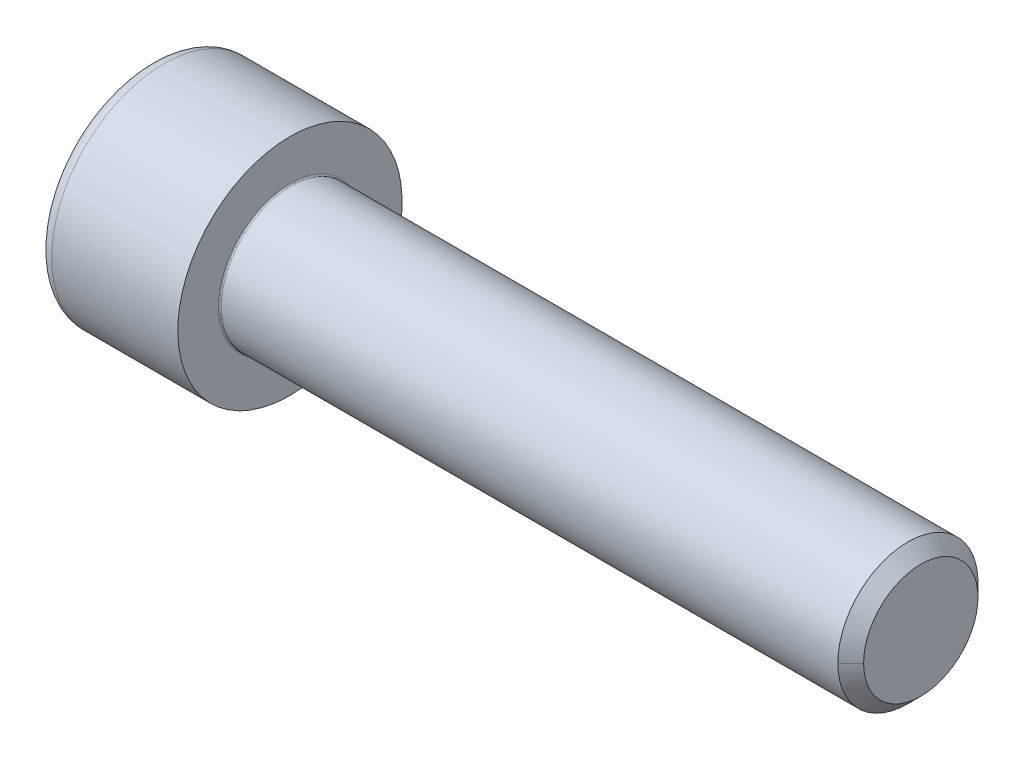
ISO-10303-21;
HEADER;
FILE_DESCRIPTION(('STEP AP214'),'2;1');
FILE_NAME('part.step','',(''),(''),'','','');
FILE_SCHEMA(('AUTOMOTIVE_DESIGN { 1 0 10303 214 1 1 1 1 }'));
ENDSEC;
DATA;
#1=APPLICATION_CONTEXT('core data for automotive mechanical design processes');
#2=APPLICATION_PROTOCOL_DEFINITION('international standard','automotive_design',2000,#1);
#3=PRODUCT_CONTEXT('',#1,'mechanical');
#4=PRODUCT('Part','Part','',(#3));
#5=PRODUCT_RELATED_PRODUCT_CATEGORY('part','',(#4));
#6=PRODUCT_DEFINITION_FORMATION('','',#4);
#7=PRODUCT_DEFINITION_CONTEXT('part definition',#1,'design');
#8=PRODUCT_DEFINITION('design','',#6,#7);
#9=PRODUCT_DEFINITION_SHAPE('','',#8);
#10=(LENGTH_UNIT() NAMED_UNIT(*) SI_UNIT(.MILLI.,.METRE.));
#11=(NAMED_UNIT(*) PLANE_ANGLE_UNIT() SI_UNIT($,.RADIAN.));
#12=(NAMED_UNIT(*) SI_UNIT($,.STERADIAN.) SOLID_ANGLE_UNIT());
#13=UNCERTAINTY_MEASURE_WITH_UNIT(LENGTH_MEASURE(1.E-05),#10,'distance_accuracy_value','');
#14=(GEOMETRIC_REPRESENTATION_CONTEXT(3) GLOBAL_UNCERTAINTY_ASSIGNED_CONTEXT((#13)) GLOBAL_UNIT_ASSIGNED_CONTEXT((#10,
#11,#12)) REPRESENTATION_CONTEXT('',''));
#15=CARTESIAN_POINT('',(0.,0.,0.));
#16=DIRECTION('',(0.,0.,1.));
#17=DIRECTION('',(1.,0.,0.));
#18=AXIS2_PLACEMENT_3D('',#15,#16,#17);
#19=CARTESIAN_POINT('',(-2.333333333,0.,0.));
#20=CARTESIAN_POINT('',(-5.016,0.,4.646514966));
#21=(BOUNDED_CURVE() B_SPLINE_CURVE(1,(#19,#20),.UNSPECIFIED.,.F.,
.F.) B_SPLINE_CURVE_WITH_KNOTS((2,2),(0.,1.),
.UNSPECIFIED.) CURVE() GEOMETRIC_REPRESENTATION_ITEM() RATIONAL_B_SPLINE_CURVE((1.,1.)) REPRESENTATION_ITEM(''));
#22=CARTESIAN_POINT('',(994.984,0.,0.));
#23=DIRECTION('',(-1.,0.,0.));
#24=AXIS1_PLACEMENT('',#22,#23);
#25=SURFACE_OF_REVOLUTION('',#21,#24);
#26=CARTESIAN_POINT('',(-2.333333333,0.,0.));
#27=VERTEX_POINT('',#26);
#28=VERTEX_LOOP('',#27);
#29=FACE_BOUND('',#28,.T.);
#30=CARTESIAN_POINT('',(-5.00000000006482,-4.,-2.30940107611895));
#31=CARTESIAN_POINT('',(-4.97135318953182,-4.,-2.21015744036067));
#32=CARTESIAN_POINT('',(-4.94397746479668,-4.,-2.1105358752082));
#33=CARTESIAN_POINT('',(-4.89209376988705,-4.,-1.91043798441548));
#34=CARTESIAN_POINT('',(-4.86758886314897,-4.,-1.80996086623569));
#35=CARTESIAN_POINT('',(-4.82182768901577,-4.,-1.60823298767985));
#36=CARTESIAN_POINT('',(-4.80057238759109,-4.,-1.50698200662196));
#37=CARTESIAN_POINT('',(-4.76171749202954,-4.,-1.30395732887976));
#38=CARTESIAN_POINT('',(-4.74411169613708,-4.,-1.20218482517622));
#39=CARTESIAN_POINT('',(-4.71285993171777,-4.,-0.998057174168331));
#40=CARTESIAN_POINT('',(-4.6992128868808,-4.,-0.895702192959739));
#41=CARTESIAN_POINT('',(-4.67617244381568,-4.,-0.690517955862912));
#42=CARTESIAN_POINT('',(-4.66677887535889,-4.,-0.5876887191213));
#43=CARTESIAN_POINT('',(-4.65011682591935,-4.,-0.347733375104196));
#44=CARTESIAN_POINT('',(-4.64457143875763,-4.,-0.2104827897911));
#45=CARTESIAN_POINT('',(-4.64166994989457,-4.,0.0641549625196647));
#46=CARTESIAN_POINT('',(-4.64431698574091,-4.,0.20154216169588));
#47=CARTESIAN_POINT('',(-4.65768334718873,-4.,0.475919706875249));
#48=CARTESIAN_POINT('',(-4.66840273377248,-4.,0.612910049872519));
#49=CARTESIAN_POINT('',(-4.69743964515601,-4.,0.886008596477056));
#50=CARTESIAN_POINT('',(-4.71575366740527,-4.,1.02211717739193));
#51=CARTESIAN_POINT('',(-4.75926532590689,-4.,1.29321352913059));
#52=CARTESIAN_POINT('',(-4.7844628536655,-4.,1.42820131758511));
#53=CARTESIAN_POINT('',(-4.84089995195073,-4.,1.69685903051749));
#54=CARTESIAN_POINT('',(-4.87213779969015,-4.,1.83052931936778));
#55=CARTESIAN_POINT('',(-4.92071313950291,-4.,2.02146177333866));
#56=CARTESIAN_POINT('',(-4.93594565661347,-4.,2.07926975435966));
#57=CARTESIAN_POINT('',(-4.96731071446001,-4.,2.19455934731437));
#58=CARTESIAN_POINT('',(-4.9834420419316,-4.,2.25204128908881));
#59=CARTESIAN_POINT('',(-5.00000000014676,-4.,2.30940107640279));
#60=B_SPLINE_CURVE_WITH_KNOTS('',3,(#30,#31,#32,#33,#34,#35,#36,#37,#38,#39,#40,#41,#42,#43,#44,
#45,#46,#47,#48,#49,#50,#51,#52,#53,#54,#55,#56,#57,#58,#59),.UNSPECIFIED.,.F.,.F.,(4,2,2,2,2,2,
2,2,2,2,2,2,2,2,4),(0.,0.309893484433195,0.620114699394315,0.93042795147056,1.24020947239432,
1.54990669042629,1.85959151295208,2.27142973921779,2.68342571148235,3.09542479618574,
3.50723408303071,3.91903687955532,4.33072239670914,4.51006028318604,4.68916169313103),.UNSPECIFIED.);
#61=CARTESIAN_POINT('',(-5.0000000001568,-3.99999999989444,-2.30940107662042));
#62=VERTEX_POINT('',#61);
#63=CARTESIAN_POINT('',(-4.99999999975451,-3.99999999977153,2.30940107713191));
#64=VERTEX_POINT('',#63);
#65=EDGE_CURVE('E113',#62,#64,#60,.T.);
#66=ORIENTED_EDGE('',*,*,#65,.T.);
#67=CARTESIAN_POINT('',(-5.00000000016685,-3.99999999954306,2.30940107726382));
#68=CARTESIAN_POINT('',(-4.97135318963593,-3.91405248981054,2.35902289514925));
#69=CARTESIAN_POINT('',(-4.94397746490307,-3.82777768362181,2.40883367773181));
#70=CARTESIAN_POINT('',(-4.8920937699984,-3.65448782694781,2.50888262314083));
#71=CARTESIAN_POINT('',(-4.86758886326301,-3.56747209010316,2.55912118223708));
#72=CARTESIAN_POINT('',(-4.82182768913561,-3.39277062261852,2.65998512152771));
#73=CARTESIAN_POINT('',(-4.80057238771403,-3.30508470086244,2.71061061206301));
#74=CARTESIAN_POINT('',(-4.76171749215909,-3.12926017233892,2.81212295094683));
#75=CARTESIAN_POINT('',(-4.74411169627012,-3.04112259872311,2.86300920280495));
#76=CARTESIAN_POINT('',(-4.71285993185824,-2.86434286733196,2.96507302832157));
#77=CARTESIAN_POINT('',(-4.6992128870252,-2.77570085339976,3.01625051893219));
#78=CARTESIAN_POINT('',(-4.67617244396809,-2.59800609161458,3.11884263749318));
#79=CARTESIAN_POINT('',(-4.6667788755154,-2.50895336034306,3.17025725587024));
#80=CARTESIAN_POINT('',(-4.65011682608512,-2.3011459366396,3.29023492789758));
#81=CARTESIAN_POINT('',(-4.64457143892918,-2.18228344306491,3.35886022056665));
#82=CARTESIAN_POINT('',(-4.64166995007861,-1.94444017270732,3.49617909674691));
#83=CARTESIAN_POINT('',(-4.64431698593167,-1.82545936805698,3.56487269634737));
#84=CARTESIAN_POINT('',(-4.65768334739383,-1.58784144368608,3.70206146896153));
#85=CARTESIAN_POINT('',(-4.66840273398519,-1.46920432656869,3.7705566404723));
#86=CARTESIAN_POINT('',(-4.69743964538433,-1.23269404745584,3.9071059137985));
#87=CARTESIAN_POINT('',(-4.71575366764156,-1.11482055870239,3.97516020426774));
#88=CARTESIAN_POINT('',(-4.75926532615933,-0.880044231207485,4.11070838016045));
#89=CARTESIAN_POINT('',(-4.78446285392611,-0.763141377197368,4.17820227439928));
#90=CARTESIAN_POINT('',(-4.84089995222764,-0.530476972859852,4.31253113088844));
#91=CARTESIAN_POINT('',(-4.8721377999752,-0.414715106976668,4.37936627532498));
#92=CARTESIAN_POINT('',(-4.92071313976593,-0.249362751534562,4.4748325022606));
#93=CARTESIAN_POINT('',(-4.93594565684413,-0.199299571539531,4.50373649271024));
#94=CARTESIAN_POINT('',(-4.96731071462198,-0.0994558554688469,4.56138128906657));
#95=CARTESIAN_POINT('',(-4.98344204205724,-0.0496750337427324,4.59012225989363));
#96=CARTESIAN_POINT('',(-5.00000000023427,-8.82094370132308E-10,4.61880215349072));
#97=B_SPLINE_CURVE_WITH_KNOTS('',3,(#67,#68,#69,#70,#71,#72,#73,#74,#75,#76,#77,#78,#79,#80,#81,
#82,#83,#84,#85,#86,#87,#88,#89,#90,#91,#92,#93,#94,#95,#96),.UNSPECIFIED.,.F.,.F.,(4,2,2,2,2,2,
2,2,2,2,2,2,2,2,4),(0.,0.309893484445331,0.62011469941857,0.930427951506925,1.24020947244285,
1.54990669048699,1.85959151302494,2.27142973933271,2.68342571163939,3.09542479638498,
3.50723408327159,3.91903687983777,4.33072239703306,4.51006028311902,4.68916169267404),.UNSPECIFIED.);
#98=CARTESIAN_POINT('',(-5.0000000002909,-1.17252272700096E-10,4.6188021535888));
#99=VERTEX_POINT('',#98);
#100=EDGE_CURVE('E109',#64,#99,#97,.T.);
#101=ORIENTED_EDGE('',*,*,#100,.T.);
#102=CARTESIAN_POINT('',(-5.00000000032998,5.94972159506391E-10,4.6188021536565));
#103=CARTESIAN_POINT('',(-4.97135318979258,0.0859475103312058,4.56918033576891));
#104=CARTESIAN_POINT('',(-4.94397746505306,0.172222316523666,4.5193695531842));
#105=CARTESIAN_POINT('',(-4.89209377013475,0.34551217320521,4.41932060777082));
#106=CARTESIAN_POINT('',(-4.86758886339237,0.432527910053683,4.36908204867237));
#107=CARTESIAN_POINT('',(-4.82182768925074,0.607229377546093,4.26821810937725));
#108=CARTESIAN_POINT('',(-4.80057238782191,0.694915299306115,4.21759261883967));
#109=CARTESIAN_POINT('',(-4.76171749225217,0.870739827838095,4.11608027995098));
#110=CARTESIAN_POINT('',(-4.74411169635568,0.958877401458407,4.06519402809025));
#111=CARTESIAN_POINT('',(-4.7128599319287,1.13565713285879,3.9631302025683));
#112=CARTESIAN_POINT('',(-4.69921288708808,1.22429914679571,3.91195271195495));
#113=CARTESIAN_POINT('',(-4.67617244401594,1.40199390859061,3.80936059338835));
#114=CARTESIAN_POINT('',(-4.66677887555579,1.49104663986712,3.75794597500841));
#115=CARTESIAN_POINT('',(-4.65011682610934,1.69885406357111,3.63796830298076));
#116=CARTESIAN_POINT('',(-4.64457143894404,1.8177165571414,3.56934301031423));
#117=CARTESIAN_POINT('',(-4.6416699500741,2.05555982749067,3.43202413413878));
#118=CARTESIAN_POINT('',(-4.64431698591716,2.1745406321371,3.36333053454058));
#119=CARTESIAN_POINT('',(-4.65768334735915,2.41215855650067,3.22614176193065));
#120=CARTESIAN_POINT('',(-4.66840273394034,2.53079567361464,3.15764659042185));
#121=CARTESIAN_POINT('',(-4.69743964531933,2.76730595272089,3.02109731709947));
#122=CARTESIAN_POINT('',(-4.71575366756658,2.88517944147114,2.95304302663207));
#123=CARTESIAN_POINT('',(-4.75926532606492,3.11995576896001,2.81749485074285));
#124=CARTESIAN_POINT('',(-4.78446285382227,3.23685862296728,2.75000095650566));
#125=CARTESIAN_POINT('',(-4.84089995210564,3.4695230272993,2.61567210001968));
#126=CARTESIAN_POINT('',(-4.87213779984446,3.58528489317983,2.54883695558467));
#127=CARTESIAN_POINT('',(-4.92071313962745,3.75063724863275,2.4533707286428));
#128=CARTESIAN_POINT('',(-4.93594565670664,3.80070042864115,2.42446673818544));
#129=CARTESIAN_POINT('',(-4.96731071448712,3.90054414473846,2.36682194181374));
#130=CARTESIAN_POINT('',(-4.98344204192404,3.95032496647782,2.33808097097903));
#131=CARTESIAN_POINT('',(-5.00000000010304,3.99999999935165,2.30940107737433));
#132=B_SPLINE_CURVE_WITH_KNOTS('',3,(#102,#103,#104,#105,#106,#107,#108,#109,#110,#111,#112,
#113,#114,#115,#116,#117,#118,#119,#120,#121,#122,#123,#124,#125,#126,#127,#128,#129,#130,#131),
.UNSPECIFIED.,.F.,.F.,(4,2,2,2,2,2,2,2,2,2,2,2,2,2,4),(0.,0.30989348446309,0.620114699454161,
0.930427951560375,1.24020947251555,1.54990669057891,1.8595915131361,2.27142973942983,
2.68342571172239,3.0954247964538,3.50723408332542,3.91903687987668,4.33072239705703,
4.51006028318852,4.68916169278907),.UNSPECIFIED.);
#133=CARTESIAN_POINT('',(-4.99999999977637,4.,2.30940107681191));
#134=VERTEX_POINT('',#133);
#135=EDGE_CURVE('E92',#99,#134,#132,.T.);
#136=ORIENTED_EDGE('',*,*,#135,.T.);
#137=CARTESIAN_POINT('',(-5.00000000021056,4.,2.30940107662382));
#138=CARTESIAN_POINT('',(-4.97135318967179,4.,2.21015744086173));
#139=CARTESIAN_POINT('',(-4.94397746493073,4.,2.11053587570543));
#140=CARTESIAN_POINT('',(-4.89209377000895,4.,1.91043798490497));
#141=CARTESIAN_POINT('',(-4.86758886326464,4.,1.80996086672125));
#142=CARTESIAN_POINT('',(-4.8218276891187,4.,1.60823298815746));
#143=CARTESIAN_POINT('',(-4.8005723876875,4.,1.50698200709554));
#144=CARTESIAN_POINT('',(-4.76171749211271,4.,1.30395732934463));
#145=CARTESIAN_POINT('',(-4.74411169621354,4.,1.20218482563642));
#146=CARTESIAN_POINT('',(-4.71285993178078,4.,0.998057174618954));
#147=CARTESIAN_POINT('',(-4.69921288693708,4.,0.895702193405464));
#148=CARTESIAN_POINT('',(-4.6761724438585,4.,0.690517956298578));
#149=CARTESIAN_POINT('',(-4.66677887539499,4.,0.587688719551803));
#150=CARTESIAN_POINT('',(-4.65011682594096,4.,0.347733375534113));
#151=CARTESIAN_POINT('',(-4.64457143877092,4.,0.21048279022553));
#152=CARTESIAN_POINT('',(-4.64166994989055,4.,-0.0641549620767052));
#153=CARTESIAN_POINT('',(-4.64431698572791,4.,-0.201542161248905));
#154=CARTESIAN_POINT('',(-4.65768334715775,4.,-0.475919706420755));
#155=CARTESIAN_POINT('',(-4.66840273373249,4.,-0.612910049414522));
#156=CARTESIAN_POINT('',(-4.69743964509803,4.,-0.886008596012247));
#157=CARTESIAN_POINT('',(-4.71575366733828,4.,-1.02211717692381));
#158=CARTESIAN_POINT('',(-4.75926532582251,4.,-1.2932135286562));
#159=CARTESIAN_POINT('',(-4.78446285357274,4.,-1.42820131710774));
#160=CARTESIAN_POINT('',(-4.84089995184177,4.,-1.69685903003438));
#161=CARTESIAN_POINT('',(-4.87213779957337,4.,-1.83052931888192));
#162=CARTESIAN_POINT('',(-4.92071313937493,4.,-2.02146177284733));
#163=CARTESIAN_POINT('',(-4.93594565648185,4.,-2.07926975386559));
#164=CARTESIAN_POINT('',(-4.96731071432123,4.,-2.19455934681486));
#165=CARTESIAN_POINT('',(-4.9834420417893,4.,-2.25204128858662));
#166=CARTESIAN_POINT('',(-5.00000000000102,4.,-2.30940107589792));
#167=B_SPLINE_CURVE_WITH_KNOTS('',3,(#137,#138,#139,#140,#141,#142,#143,#144,#145,#146,#147,
#148,#149,#150,#151,#152,#153,#154,#155,#156,#157,#158,#159,#160,#161,#162,#163,#164,#165,#166),
.UNSPECIFIED.,.F.,.F.,(4,2,2,2,2,2,2,2,2,2,2,2,2,2,4),(0.,0.309893484448983,0.620114699425957,
0.930427951518078,1.24020947245909,1.5499066905083,1.85959151305134,2.27142973930458,
2.68342571155658,3.09542479624739,3.5072340830789,3.91903687959009,4.33072239673047,
4.51006028319663,4.68916169313102),.UNSPECIFIED.);
#168=CARTESIAN_POINT('',(-4.99999999982738,3.99999999999015,-2.30940107700569));
#169=VERTEX_POINT('',#168);
#170=EDGE_CURVE('E568',#134,#169,#167,.T.);
#171=ORIENTED_EDGE('',*,*,#170,.T.);
#172=CARTESIAN_POINT('',(-5.00000000031259,3.9999999999803,-2.30940107701138));
#173=CARTESIAN_POINT('',(-4.97135318977591,3.91405249024418,-2.35902289489889));
#174=CARTESIAN_POINT('',(-4.94397746503701,3.82777768405185,-2.40883367748352));
#175=CARTESIAN_POINT('',(-4.89209377011994,3.6544878273706,-2.50888262289673));
#176=CARTESIAN_POINT('',(-4.86758886337818,3.56747209052229,-2.55912118199509));
#177=CARTESIAN_POINT('',(-4.82182768923793,3.39277062303019,-2.65998512129003));
#178=CARTESIAN_POINT('',(-4.80057238780987,3.30508470127032,-2.71061061182753));
#179=CARTESIAN_POINT('',(-4.76171749224182,3.12926017273923,-2.81212295071571));
#180=CARTESIAN_POINT('',(-4.74411169634621,3.04112259911966,-2.863009202576));
#181=CARTESIAN_POINT('',(-4.71285993192095,2.8643428677208,-2.96507302809708));
#182=CARTESIAN_POINT('',(-4.69921288708117,2.77570085378465,-3.01625051870998));
#183=CARTESIAN_POINT('',(-4.67617244401074,2.59800609199132,-3.11884263727567));
#184=CARTESIAN_POINT('',(-4.66677887555145,2.50895336071561,-3.17025725565515));
#185=CARTESIAN_POINT('',(-4.65011682610679,2.30114593701222,-3.29023492768245));
#186=CARTESIAN_POINT('',(-4.64457143894244,2.18228344344176,-3.35886022034908));
#187=CARTESIAN_POINT('',(-4.64166995007455,1.94444017309218,-3.49617909652472));
#188=CARTESIAN_POINT('',(-4.6443169859187,1.82545936844562,-3.56487269612299));
#189=CARTESIAN_POINT('',(-4.65768334736269,1.58784144408185,-3.70206146873303));
#190=CARTESIAN_POINT('',(-4.66840273394481,1.46920432696782,-3.77055664024187));
#191=CARTESIAN_POINT('',(-4.69743964532579,1.23269404786089,-3.90710591356464));
#192=CARTESIAN_POINT('',(-4.71575366757414,1.11482055911003,-3.97516020403239));
#193=CARTESIAN_POINT('',(-4.75926532607468,0.880044231619982,-4.11070837992229));
#194=CARTESIAN_POINT('',(-4.78446285383313,0.763141377612138,-4.17820227415982));
#195=CARTESIAN_POINT('',(-4.8408999521185,0.530476973278929,-4.31253113064648));
#196=CARTESIAN_POINT('',(-4.87213779985824,0.41471510739778,-4.37936627508185));
#197=CARTESIAN_POINT('',(-4.92071313969914,0.249362751751897,-4.47483250213512));
#198=CARTESIAN_POINT('',(-4.93594565683901,0.199299571551989,-4.50373649270305));
#199=CARTESIAN_POINT('',(-4.96731071474743,0.0994558550738184,-4.56138128929464));
#200=CARTESIAN_POINT('',(-4.98344204225158,0.0496750331450903,-4.59012226023868));
#201=CARTESIAN_POINT('',(-5.00000000050074,8.26869355823132E-11,-4.61880215395226));
#202=B_SPLINE_CURVE_WITH_KNOTS('',3,(#172,#173,#174,#175,#176,#177,#178,#179,#180,#181,#182,
#183,#184,#185,#186,#187,#188,#189,#190,#191,#192,#193,#194,#195,#196,#197,#198,#199,#200,#201),
.UNSPECIFIED.,.F.,.F.,(4,2,2,2,2,2,2,2,2,2,2,2,2,2,4),(0.,0.309893484462129,0.620114699452223,
0.930427951557453,1.24020947250963,1.54990669057001,1.85959151312421,2.27142973941845,
2.68342571171151,3.09542479644338,3.50723408331751,3.91903687987133,4.33072239705442,
4.51006028387372,4.68916169416026),.UNSPECIFIED.);
#203=CARTESIAN_POINT('',(-5.00000000025101,-9.47332591324625E-10,-4.61880215454694));
#204=VERTEX_POINT('',#203);
#205=EDGE_CURVE('E563',#169,#204,#202,.T.);
#206=ORIENTED_EDGE('',*,*,#205,.T.);
#207=CARTESIAN_POINT('',(-5.00000000006351,-1.39437824583332E-09,-4.61880215319496));
#208=CARTESIAN_POINT('',(-4.97135318953658,-0.0859475111244712,-4.56918033531092));
#209=CARTESIAN_POINT('',(-4.94397746480797,-0.1722223173108,-4.51936955272975));
#210=CARTESIAN_POINT('',(-4.89209376991206,-0.345512173979944,-4.41932060732353));
#211=CARTESIAN_POINT('',(-4.86758886318118,-0.432527910822148,-4.36908204822869));
#212=CARTESIAN_POINT('',(-4.82182768906282,-0.607229378301781,-4.26821810894096));
#213=CARTESIAN_POINT('',(-4.80057238764577,-0.694915300055294,-4.21759261840713));
#214=CARTESIAN_POINT('',(-4.76171749210012,-0.870739828573459,-4.11608027952642));
#215=CARTESIAN_POINT('',(-4.74411169621593,-0.95887740218646,-4.06519402766991));
#216=CARTESIAN_POINT('',(-4.71285993181364,-1.13565713357187,-3.9631302021566));
#217=CARTESIAN_POINT('',(-4.69921288698543,-1.22429914750113,-3.91195271154768));
#218=CARTESIAN_POINT('',(-4.67617244393784,-1.40199390928026,-3.80936059299018));
#219=CARTESIAN_POINT('',(-4.66677887548984,-1.49104664054866,-3.75794597461492));
#220=CARTESIAN_POINT('',(-4.65011682606976,-1.69885406425188,-3.63796830258772));
#221=CARTESIAN_POINT('',(-4.64457143891977,-1.81771655782941,-3.56934300991701));
#222=CARTESIAN_POINT('',(-4.64166995008143,-2.05555982819237,-3.43202413373365));
#223=CARTESIAN_POINT('',(-4.64431698594077,-2.17454063284525,-3.36333053413173));
#224=CARTESIAN_POINT('',(-4.65768334741573,-2.4121585572209,-3.22614176151482));
#225=CARTESIAN_POINT('',(-4.66840273401361,-2.5307956743405,-3.15764659000278));
#226=CARTESIAN_POINT('',(-4.69743964542553,-2.76730595345756,-3.02109731667415));
#227=CARTESIAN_POINT('',(-4.71575366768903,-2.88517944221298,-2.95304302620377));
#228=CARTESIAN_POINT('',(-4.75926532621914,-3.11995576971161,-2.81749485030891));
#229=CARTESIAN_POINT('',(-4.784462853992,-3.23685862372347,-2.75000095606907));
#230=CARTESIAN_POINT('',(-4.84089995230506,-3.46952302806436,-2.61567209957797));
#231=CARTESIAN_POINT('',(-4.87213780005806,-3.58528489394918,-2.54883695514048));
#232=CARTESIAN_POINT('',(-4.92071313984347,-3.75063724934972,-2.45337072822886));
#233=CARTESIAN_POINT('',(-4.93594565691019,-3.80070042930177,-2.42446673780403));
#234=CARTESIAN_POINT('',(-4.96731071466345,-3.90054414528696,-2.36682194149706));
#235=CARTESIAN_POINT('',(-4.98344204208561,-3.95032496697057,-2.33808097069455));
#236=CARTESIAN_POINT('',(-5.00000000024879,-3.99999999978888,-2.30940107712189));
#237=B_SPLINE_CURVE_WITH_KNOTS('',3,(#207,#208,#209,#210,#211,#212,#213,#214,#215,#216,#217,
#218,#219,#220,#221,#222,#223,#224,#225,#226,#227,#228,#229,#230,#231,#232,#233,#234,#235,#236),
.UNSPECIFIED.,.F.,.F.,(4,2,2,2,2,2,2,2,2,2,2,2,2,2,4),(0.,0.309893484433924,0.620114699395706,
0.930427951472585,1.2402094723965,1.54990669042863,1.85959151295455,2.27142973927141,
2.68342571158722,3.09542479634199,3.50723408323792,3.91903687981338,4.33072239701794,
4.51006028295118,4.68916169235381),.UNSPECIFIED.);
#238=EDGE_CURVE('E21',#204,#62,#237,.T.);
#239=ORIENTED_EDGE('',*,*,#238,.T.);
#240=EDGE_LOOP('',(#66,#101,#136,#171,#206,#239));
#241=FACE_BOUND('',#240,.T.);
#242=ADVANCED_FACE('F17',(#29,#241),#25,.F.);
#243=CARTESIAN_POINT('',(-10.,-4.,-2.309401077));
#244=DIRECTION('',(0.,-0.500000000039214,-0.866025403761798));
#245=DIRECTION('',(0.,0.866025403761798,-0.500000000039214));
#246=AXIS2_PLACEMENT_3D('',#243,#244,#245);
#247=PLANE('',#246);
#248=DIRECTION('',(0.,0.866025403761798,-0.500000000039214));
#249=VECTOR('',#248,1.);
#250=CARTESIAN_POINT('',(-10.,-3.99999999972744,-2.30940107715736));
#251=LINE('',#250,#249);
#252=CARTESIAN_POINT('',(-10.,-4.,-2.309401077));
#253=VERTEX_POINT('',#252);
#254=CARTESIAN_POINT('',(-10.,0.,-4.618802154));
#255=VERTEX_POINT('',#254);
#256=EDGE_CURVE('E159',#253,#255,#251,.T.);
#257=ORIENTED_EDGE('',*,*,#256,.F.);
#258=DIRECTION('',(1.,0.,0.));
#259=VECTOR('',#258,1.);
#260=CARTESIAN_POINT('',(-10.,-4.,-2.309401077));
#261=LINE('',#260,#259);
#262=EDGE_CURVE('E155',#253,#62,#261,.T.);
#263=ORIENTED_EDGE('',*,*,#262,.T.);
#264=ORIENTED_EDGE('',*,*,#238,.F.);
#265=DIRECTION('',(1.,0.,0.));
#266=VECTOR('',#265,1.);
#267=CARTESIAN_POINT('',(-10.,0.,-4.618802154));
#268=LINE('',#267,#266);
#269=EDGE_CURVE('E565',#204,#255,#268,.F.);
#270=ORIENTED_EDGE('',*,*,#269,.T.);
#271=EDGE_LOOP('',(#257,#263,#264,#270));
#272=FACE_BOUND('',#271,.T.);
#273=ADVANCED_FACE('F359',(#272),#247,.F.);
#274=CARTESIAN_POINT('',(-10.,0.,-4.618802154));
#275=DIRECTION('',(0.,0.500000000039214,-0.866025403761798));
#276=DIRECTION('',(0.,0.866025403761798,0.500000000039214));
#277=AXIS2_PLACEMENT_3D('',#274,#275,#276);
#278=PLANE('',#277);
#279=DIRECTION('',(0.,0.866025403761798,0.500000000039214));
#280=VECTOR('',#279,1.);
#281=CARTESIAN_POINT('',(-10.,-1.68999623323396E-09,-4.61880215497572));
#282=LINE('',#281,#280);
#283=CARTESIAN_POINT('',(-10.,4.,-2.309401077));
#284=VERTEX_POINT('',#283);
#285=EDGE_CURVE('E162',#255,#284,#282,.T.);
#286=ORIENTED_EDGE('',*,*,#285,.F.);
#287=ORIENTED_EDGE('',*,*,#269,.F.);
#288=ORIENTED_EDGE('',*,*,#205,.F.);
#289=DIRECTION('',(1.,0.,0.));
#290=VECTOR('',#289,1.);
#291=CARTESIAN_POINT('',(-10.,4.,-2.309401077));
#292=LINE('',#291,#290);
#293=EDGE_CURVE('E104',#169,#284,#292,.F.);
#294=ORIENTED_EDGE('',*,*,#293,.T.);
#295=EDGE_LOOP('',(#286,#287,#288,#294));
#296=FACE_BOUND('',#295,.T.);
#297=ADVANCED_FACE('F348',(#296),#278,.F.);
#298=CARTESIAN_POINT('',(-10.,4.,-2.309401077));
#299=DIRECTION('',(0.,1.,0.));
#300=DIRECTION('',(0.,0.,1.));
#301=AXIS2_PLACEMENT_3D('',#298,#299,#300);
#302=PLANE('',#301);
#303=DIRECTION('',(0.,0.,1.));
#304=VECTOR('',#303,1.);
#305=CARTESIAN_POINT('',(-10.,4.,-7.084024601));
#306=LINE('',#305,#304);
#307=CARTESIAN_POINT('',(-10.,4.,2.309401077));
#308=VERTEX_POINT('',#307);
#309=EDGE_CURVE('E165',#284,#308,#306,.T.);
#310=ORIENTED_EDGE('',*,*,#309,.F.);
#311=ORIENTED_EDGE('',*,*,#293,.F.);
#312=ORIENTED_EDGE('',*,*,#170,.F.);
#313=DIRECTION('',(1.,0.,0.));
#314=VECTOR('',#313,1.);
#315=CARTESIAN_POINT('',(-10.,4.,2.309401077));
#316=LINE('',#315,#314);
#317=EDGE_CURVE('E99',#134,#308,#316,.F.);
#318=ORIENTED_EDGE('',*,*,#317,.T.);
#319=EDGE_LOOP('',(#310,#311,#312,#318));
#320=FACE_BOUND('',#319,.T.);
#321=ADVANCED_FACE('F339',(#320),#302,.F.);
#322=CARTESIAN_POINT('',(-10.,4.,2.309401077));
#323=DIRECTION('',(0.,0.500000000039214,0.866025403761798));
#324=DIRECTION('',(0.,-0.866025403761798,0.500000000039214));
#325=AXIS2_PLACEMENT_3D('',#322,#323,#324);
#326=PLANE('',#325);
#327=DIRECTION('',(0.,-0.866025403761798,0.500000000039214));
#328=VECTOR('',#327,1.);
#329=CARTESIAN_POINT('',(-10.,4.0000000022251,2.30940107571534));
#330=LINE('',#329,#328);
#331=CARTESIAN_POINT('',(-10.,0.,4.618802154));
#332=VERTEX_POINT('',#331);
#333=EDGE_CURVE('E168',#308,#332,#330,.T.);
#334=ORIENTED_EDGE('',*,*,#333,.F.);
#335=ORIENTED_EDGE('',*,*,#317,.F.);
#336=ORIENTED_EDGE('',*,*,#135,.F.);
#337=DIRECTION('',(1.,0.,0.));
#338=VECTOR('',#337,1.);
#339=CARTESIAN_POINT('',(-10.,0.,4.618802154));
#340=LINE('',#339,#338);
#341=EDGE_CURVE('E96',#99,#332,#340,.F.);
#342=ORIENTED_EDGE('',*,*,#341,.T.);
#343=EDGE_LOOP('',(#334,#335,#336,#342));
#344=FACE_BOUND('',#343,.T.);
#345=ADVANCED_FACE('F95',(#344),#326,.F.);
#346=CARTESIAN_POINT('',(-10.,0.,4.618802154));
#347=DIRECTION('',(0.,-0.500000000039214,0.866025403761798));
#348=DIRECTION('',(0.,-0.866025403761798,-0.500000000039214));
#349=AXIS2_PLACEMENT_3D('',#346,#347,#348);
#350=PLANE('',#349);
#351=DIRECTION('',(0.,-0.866025403761798,-0.500000000039215));
#352=VECTOR('',#351,1.);
#353=CARTESIAN_POINT('',(-10.,4.18765716547753E-09,4.61880215641775));
#354=LINE('',#353,#352);
#355=CARTESIAN_POINT('',(-10.,-4.,2.309401077));
#356=VERTEX_POINT('',#355);
#357=EDGE_CURVE('E111',#332,#356,#354,.T.);
#358=ORIENTED_EDGE('',*,*,#357,.F.);
#359=ORIENTED_EDGE('',*,*,#341,.F.);
#360=ORIENTED_EDGE('',*,*,#100,.F.);
#361=DIRECTION('',(1.,0.,0.));
#362=VECTOR('',#361,1.);
#363=CARTESIAN_POINT('',(-10.,-4.,2.309401077));
#364=LINE('',#363,#362);
#365=EDGE_CURVE('E152',#64,#356,#364,.F.);
#366=ORIENTED_EDGE('',*,*,#365,.T.);
#367=EDGE_LOOP('',(#358,#359,#360,#366));
#368=FACE_BOUND('',#367,.T.);
#369=ADVANCED_FACE('F107',(#368),#350,.F.);
#370=CARTESIAN_POINT('',(-10.,-4.,2.309401077));
#371=DIRECTION('',(0.,-1.,0.));
#372=DIRECTION('',(0.,0.,-1.));
#373=AXIS2_PLACEMENT_3D('',#370,#371,#372);
#374=PLANE('',#373);
#375=DIRECTION('',(0.,0.,1.));
#376=VECTOR('',#375,1.);
#377=CARTESIAN_POINT('',(-10.,-4.,-7.084024601));
#378=LINE('',#377,#376);
#379=EDGE_CURVE('E173',#356,#253,#378,.F.);
#380=ORIENTED_EDGE('',*,*,#379,.F.);
#381=ORIENTED_EDGE('',*,*,#365,.F.);
#382=ORIENTED_EDGE('',*,*,#65,.F.);
#383=ORIENTED_EDGE('',*,*,#262,.F.);
#384=EDGE_LOOP('',(#380,#381,#382,#383));
#385=FACE_BOUND('',#384,.T.);
#386=ADVANCED_FACE('F137',(#385),#374,.F.);
#387=CARTESIAN_POINT('',(-10.,7.084000146,-7.084024601));
#388=DIRECTION('',(-1.,0.,0.));
#389=DIRECTION('',(0.,-1.,0.));
#390=AXIS2_PLACEMENT_3D('',#387,#388,#389);
#391=PLANE('',#390);
#392=ORIENTED_EDGE('',*,*,#357,.T.);
#393=ORIENTED_EDGE('',*,*,#379,.T.);
#394=ORIENTED_EDGE('',*,*,#256,.T.);
#395=ORIENTED_EDGE('',*,*,#285,.T.);
#396=ORIENTED_EDGE('',*,*,#309,.T.);
#397=ORIENTED_EDGE('',*,*,#333,.T.);
#398=EDGE_LOOP('',(#392,#393,#394,#395,#396,#397));
#399=FACE_BOUND('',#398,.T.);
#400=CARTESIAN_POINT('',(-10.,0.,0.));
#401=DIRECTION('',(1.,0.,0.));
#402=DIRECTION('',(0.,1.,0.));
#403=AXIS2_PLACEMENT_3D('',#400,#401,#402);
#404=CIRCLE('',#403,7.);
#405=CARTESIAN_POINT('',(-9.99999999999999,7.,0.));
#406=VERTEX_POINT('',#405);
#407=EDGE_CURVE('E177',#406,#406,#404,.T.);
#408=ORIENTED_EDGE('',*,*,#407,.F.);
#409=EDGE_LOOP('',(#408));
#410=FACE_BOUND('',#409,.T.);
#411=ADVANCED_FACE('F143',(#399,#410),#391,.T.);
#412=CARTESIAN_POINT('',(45.,-4.1287829,-4.1287829));
#413=DIRECTION('',(1.,0.,0.));
#414=DIRECTION('',(0.,1.,0.));
#415=AXIS2_PLACEMENT_3D('',#412,#413,#414);
#416=PLANE('',#415);
#417=CARTESIAN_POINT('',(45.,0.,0.));
#418=DIRECTION('',(-1.,0.,0.));
#419=DIRECTION('',(0.,0.,1.));
#420=AXIS2_PLACEMENT_3D('',#417,#418,#419);
#421=CIRCLE('',#420,4.079825);
#422=CARTESIAN_POINT('',(45.,-1.39464349213777E-09,-4.07982499993932));
#423=VERTEX_POINT('',#422);
#424=CARTESIAN_POINT('',(45.,-1.22113492786347E-10,4.07982499993932));
#425=VERTEX_POINT('',#424);
#426=EDGE_CURVE('E181',#423,#425,#421,.F.);
#427=ORIENTED_EDGE('',*,*,#426,.T.);
#428=CARTESIAN_POINT('',(45.,0.,0.));
#429=DIRECTION('',(-1.,0.,0.));
#430=DIRECTION('',(0.,0.,1.));
#431=AXIS2_PLACEMENT_3D('',#428,#429,#430);
#432=CIRCLE('',#431,4.079825);
#433=EDGE_CURVE('E186',#425,#423,#432,.F.);
#434=ORIENTED_EDGE('',*,*,#433,.T.);
#435=EDGE_LOOP('',(#427,#434));
#436=FACE_BOUND('',#435,.T.);
#437=ADVANCED_FACE('F227',(#436),#416,.T.);
#438=CARTESIAN_POINT('',(-9.,0.,0.));
#439=DIRECTION('',(1.,0.,0.));
#440=DIRECTION('',(0.,1.,0.));
#441=AXIS2_PLACEMENT_3D('',#438,#439,#440);
#442=TOROIDAL_SURFACE('',#441,7.,1.);
#443=ORIENTED_EDGE('',*,*,#407,.T.);
#444=EDGE_LOOP('',(#443));
#445=FACE_BOUND('',#444,.T.);
#446=CARTESIAN_POINT('',(-9.,0.,0.));
#447=DIRECTION('',(1.,0.,0.));
#448=DIRECTION('',(0.,1.,0.));
#449=AXIS2_PLACEMENT_3D('',#446,#447,#448);
#450=CIRCLE('',#449,8.);
#451=CARTESIAN_POINT('',(-8.99999999999999,8.,0.));
#452=VERTEX_POINT('',#451);
#453=EDGE_CURVE('E194',#452,#452,#450,.F.);
#454=ORIENTED_EDGE('',*,*,#453,.T.);
#455=EDGE_LOOP('',(#454));
#456=FACE_BOUND('',#455,.T.);
#457=ADVANCED_FACE('F224',(#445,#456),#442,.T.);
#458=CARTESIAN_POINT('',(45.0001414213562,0.,4.07968357864376));
#459=CARTESIAN_POINT('',(45.,0.,4.079825));
#460=CARTESIAN_POINT('',(44.079825,0.,5.));
#461=(BOUNDED_CURVE() B_SPLINE_CURVE(1,(#458,#459,#460),.UNSPECIFIED.,.F.,
.F.) B_SPLINE_CURVE_WITH_KNOTS((2,1,2),(-0.000153689613750558,1.7281437146533E-11,1.),
.UNSPECIFIED.) CURVE() GEOMETRIC_REPRESENTATION_ITEM() RATIONAL_B_SPLINE_CURVE((1.,1.,1.)) REPRESENTATION_ITEM(''));
#462=CARTESIAN_POINT('',(1044.079825,0.,0.));
#463=DIRECTION('',(-1.,0.,0.));
#464=AXIS1_PLACEMENT('',#462,#463);
#465=SURFACE_OF_REVOLUTION('',#461,#464);
#466=DIRECTION('',(-0.707106781093306,-2.90060050334286E-10,-0.707106781279789));
#467=VECTOR('',#466,1.);
#468=CARTESIAN_POINT('',(44.5399832106781,-1.86227423181419E-09,-4.53984178932188));
#469=LINE('',#468,#467);
#470=CARTESIAN_POINT('',(44.079825,-2.05103428517833E-09,-5.00000000006064));
#471=VERTEX_POINT('',#470);
#472=EDGE_CURVE('E190',#423,#471,#469,.T.);
#473=ORIENTED_EDGE('',*,*,#472,.T.);
#474=CARTESIAN_POINT('',(44.0798250000001,0.,0.));
#475=DIRECTION('',(-1.,0.,0.));
#476=DIRECTION('',(0.,0.,1.));
#477=AXIS2_PLACEMENT_3D('',#474,#475,#476);
#478=CIRCLE('',#477,5.);
#479=CARTESIAN_POINT('',(44.079825,-4.48965921697616E-10,5.00000000006064));
#480=VERTEX_POINT('',#479);
#481=EDGE_CURVE('E198',#471,#480,#478,.F.);
#482=ORIENTED_EDGE('',*,*,#481,.T.);
#483=DIRECTION('',(0.707106781093306,0.,-0.707106781279789));
#484=VECTOR('',#483,1.);
#485=CARTESIAN_POINT('',(44.5399832106781,0.,4.53984178932188));
#486=LINE('',#485,#484);
#487=EDGE_CURVE('E43',#480,#425,#486,.T.);
#488=ORIENTED_EDGE('',*,*,#487,.T.);
#489=ORIENTED_EDGE('',*,*,#426,.F.);
#490=EDGE_LOOP('',(#473,#482,#488,#489));
#491=FACE_BOUND('',#490,.T.);
#492=ADVANCED_FACE('F226',(#491),#465,.T.);
#493=CARTESIAN_POINT('',(45.,0.,4.079825));
#494=CARTESIAN_POINT('',(44.079825,0.,5.));
#495=(BOUNDED_CURVE() B_SPLINE_CURVE(1,(#493,#494),.UNSPECIFIED.,.F.,
.F.) B_SPLINE_CURVE_WITH_KNOTS((2,2),(0.,0.999999999999969),
.UNSPECIFIED.) CURVE() GEOMETRIC_REPRESENTATION_ITEM() RATIONAL_B_SPLINE_CURVE((1.,1.)) REPRESENTATION_ITEM(''));
#496=CARTESIAN_POINT('',(1044.079825,0.,0.));
#497=DIRECTION('',(-1.,0.,0.));
#498=AXIS1_PLACEMENT('',#496,#497);
#499=SURFACE_OF_REVOLUTION('',#495,#498);
#500=ORIENTED_EDGE('',*,*,#433,.F.);
#501=ORIENTED_EDGE('',*,*,#487,.F.);
#502=CARTESIAN_POINT('',(44.0798250000001,0.,0.));
#503=DIRECTION('',(-1.,0.,0.));
#504=DIRECTION('',(0.,0.,1.));
#505=AXIS2_PLACEMENT_3D('',#502,#503,#504);
#506=CIRCLE('',#505,5.);
#507=EDGE_CURVE('E202',#480,#471,#506,.F.);
#508=ORIENTED_EDGE('',*,*,#507,.T.);
#509=ORIENTED_EDGE('',*,*,#472,.F.);
#510=EDGE_LOOP('',(#500,#501,#508,#509));
#511=FACE_BOUND('',#510,.T.);
#512=ADVANCED_FACE('F271',(#511),#499,.T.);
#513=CARTESIAN_POINT('',(-9.,8.,0.));
#514=CARTESIAN_POINT('',(0.,8.,0.));
#515=(BOUNDED_CURVE() B_SPLINE_CURVE(1,(#513,#514),.UNSPECIFIED.,.F.,
.F.) B_SPLINE_CURVE_WITH_KNOTS((2,2),(0.,1.),
.UNSPECIFIED.) CURVE() GEOMETRIC_REPRESENTATION_ITEM() RATIONAL_B_SPLINE_CURVE((1.,1.)) REPRESENTATION_ITEM(''));
#516=CARTESIAN_POINT('',(-5.,0.,0.));
#517=DIRECTION('',(1.,0.,0.));
#518=AXIS1_PLACEMENT('',#516,#517);
#519=SURFACE_OF_REVOLUTION('',#515,#518);
#520=ORIENTED_EDGE('',*,*,#453,.F.);
#521=EDGE_LOOP('',(#520));
#522=FACE_BOUND('',#521,.T.);
#523=CARTESIAN_POINT('',(0.,-8.,-2.18777076182895E-09));
#524=CARTESIAN_POINT('',(0.,-7.99999875998973,-0.22461468250702));
#525=CARTESIAN_POINT('',(0.,-7.99053238006944,-0.449270080856571));
#526=CARTESIAN_POINT('',(0.,-7.95272546514436,-0.89703200024488));
#527=CARTESIAN_POINT('',(0.,-7.92437935789761,-1.12013804435168));
#528=CARTESIAN_POINT('',(0.,-7.84894998381332,-1.5635313813853));
#529=CARTESIAN_POINT('',(0.,-7.80183697390442,-1.78381362417748));
#530=CARTESIAN_POINT('',(0.,-7.68916336830862,-2.21979829937832));
#531=CARTESIAN_POINT('',(0.,-7.62358780223554,-2.43549686182321));
#532=CARTESIAN_POINT('',(0.,-7.47460125039743,-2.86022664712076));
#533=CARTESIAN_POINT('',(0.,-7.39122116684479,-3.0692687099402));
#534=CARTESIAN_POINT('',(0.,-7.20710962665558,-3.47968067557249));
#535=CARTESIAN_POINT('',(0.,-7.10637033082544,-3.68104706175977));
#536=CARTESIAN_POINT('',(0.,-6.88827880679228,-4.07458286204668));
#537=CARTESIAN_POINT('',(0.,-6.77092595616682,-4.26675193121018));
#538=CARTESIAN_POINT('',(0.,-6.52050152663068,-4.64043367815887));
#539=CARTESIAN_POINT('',(0.,-6.38743706625392,-4.82195112654444));
#540=CARTESIAN_POINT('',(0.,-6.10640174941582,-5.17324730415084));
#541=CARTESIAN_POINT('',(0.,-5.95842131931418,-5.34301837470281));
#542=CARTESIAN_POINT('',(0.,-5.64882830988117,-5.66932724702104));
#543=CARTESIAN_POINT('',(0.,-5.48722901155547,-5.82587764983465));
#544=CARTESIAN_POINT('',(0.,-5.15134682294086,-6.12488400890291));
#545=CARTESIAN_POINT('',(0.,-4.97705822025155,-6.26733354836708));
#546=CARTESIAN_POINT('',(0.,-4.61705935458291,-6.53707615934584));
#547=CARTESIAN_POINT('',(0.,-4.43134645556733,-6.66436571280943));
#548=CARTESIAN_POINT('',(0.,-4.04988677519979,-6.90282570202025));
#549=CARTESIAN_POINT('',(0.,-3.85414160736631,-7.01399871889305));
#550=CARTESIAN_POINT('',(0.,-3.45397890101259,-7.21946096717838));
#551=CARTESIAN_POINT('',(0.,-3.24956124497338,-7.31374996970892));
#552=CARTESIAN_POINT('',(0.,-2.83351421561302,-7.48476998807193));
#553=CARTESIAN_POINT('',(0.,-2.62188500970059,-7.56150141116701));
#554=CARTESIAN_POINT('',(0.,-2.19291242097554,-7.69686435000022));
#555=CARTESIAN_POINT('',(0.,-1.97556897280691,-7.75549565862249));
#556=CARTESIAN_POINT('',(0.,-1.53676223719492,-7.85422981857677));
#557=CARTESIAN_POINT('',(0.,-1.31529983704063,-7.89433661338258));
#558=CARTESIAN_POINT('',(0.,-0.869689119973763,-7.95576822118658));
#559=CARTESIAN_POINT('',(0.,-0.645539700794323,-7.97708503891878));
#560=CARTESIAN_POINT('',(0.,-0.196241826356169,-8.00075598734469));
#561=CARTESIAN_POINT('',(0.,0.0289066289025437,-8.00311011803839));
#562=CARTESIAN_POINT('',(0.,0.478505533185211,-7.98884201129444));
#563=CARTESIAN_POINT('',(0.,0.702956238255692,-7.97222784068457));
#564=CARTESIAN_POINT('',(0.,1.14970846623182,-7.92014874354671));
#565=CARTESIAN_POINT('',(0.,1.37200952112858,-7.88467980214198));
#566=CARTESIAN_POINT('',(0.,1.81283088403122,-7.79514135735049));
#567=CARTESIAN_POINT('',(0.,2.0313512352682,-7.74107206680042));
#568=CARTESIAN_POINT('',(0.,2.46306533117492,-7.61471575822855));
#569=CARTESIAN_POINT('',(0.,2.67625895215662,-7.54242831760792));
#570=CARTESIAN_POINT('',(0.,3.0957957441581,-7.38015137166699));
#571=CARTESIAN_POINT('',(0.,3.30213900799606,-7.29016210631015));
#572=CARTESIAN_POINT('',(0.,3.70654361467264,-7.09310483468759));
#573=CARTESIAN_POINT('',(0.,3.90460362414193,-6.98603409204156));
#574=CARTESIAN_POINT('',(0.,4.29095330412934,-6.75561233908834));
#575=CARTESIAN_POINT('',(0.,4.47924522642473,-6.63226510434321));
#576=CARTESIAN_POINT('',(0.,4.84468668285837,-6.37020749748653));
#577=CARTESIAN_POINT('',(0.,5.02184122351684,-6.23150410688438));
#578=CARTESIAN_POINT('',(0.,5.36400790043659,-5.93953274382113));
#579=CARTESIAN_POINT('',(0.,5.52900815329442,-5.78625084454315));
#580=CARTESIAN_POINT('',(0.,5.84540082054296,-5.46642974795555));
#581=CARTESIAN_POINT('',(0.,5.99680195082551,-5.29989917288617));
#582=CARTESIAN_POINT('',(0.,6.28510539747653,-4.9545999322842));
#583=CARTESIAN_POINT('',(0.,6.42200113599884,-4.77582577456692));
#584=CARTESIAN_POINT('',(0.,6.68023687276792,-4.40738494727181));
#585=CARTESIAN_POINT('',(0.,6.80157745374661,-4.21771868612286));
#586=CARTESIAN_POINT('',(0.,7.02779461293578,-3.82892460482356));
#587=CARTESIAN_POINT('',(0.,7.13267861742643,-3.62980110554976));
#588=CARTESIAN_POINT('',(0.,7.32546970997018,-3.22307763956359));
#589=CARTESIAN_POINT('',(0.,7.41334720591343,-3.01546364578283));
#590=CARTESIAN_POINT('',(0.,7.57120900698422,-2.5937319417674));
#591=CARTESIAN_POINT('',(0.,7.64120779297924,-2.37961965311547));
#592=CARTESIAN_POINT('',(0.,7.7628100228469,-1.94660679015185));
#593=CARTESIAN_POINT('',(0.,7.81444251448331,-1.72771436332939));
#594=CARTESIAN_POINT('',(0.,7.89908959701109,-1.28640384828472));
#595=CARTESIAN_POINT('',(0.,7.93210967918249,-1.0639868198685));
#596=CARTESIAN_POINT('',(0.,7.97046340656886,-0.701020588032148));
#597=CARTESIAN_POINT('',(0.,7.98153617098029,-0.561052837462174));
#598=CARTESIAN_POINT('',(0.,7.99630485514289,-0.280728692351293));
#599=CARTESIAN_POINT('',(0.,8.00000077489406,-0.140372297810386));
#600=CARTESIAN_POINT('',(0.,7.99999876006459,0.224614679839294));
#601=CARTESIAN_POINT('',(0.,7.99053238021927,0.449270078191374));
#602=CARTESIAN_POINT('',(0.,7.95272546544368,0.89703199759119));
#603=CARTESIAN_POINT('',(0.,7.92437935827144,1.12013804170697));
#604=CARTESIAN_POINT('',(0.,7.84894998433512,1.56353137876596));
#605=CARTESIAN_POINT('',(0.,7.80183697449957,1.78381362157455));
#606=CARTESIAN_POINT('',(0.,7.68916336904888,2.21979829681419));
#607=CARTESIAN_POINT('',(0.,7.62358780304756,2.43549685928148));
#608=CARTESIAN_POINT('',(0.,7.47460125135084,2.86022664462922));
#609=CARTESIAN_POINT('',(0.,7.39122116786789,3.06926870747643));
#610=CARTESIAN_POINT('',(0.,7.2071096278155,3.47968067317007));
#611=CARTESIAN_POINT('',(0.,7.10637033205249,3.68104705939092));
#612=CARTESIAN_POINT('',(0.,6.88827880815051,4.07458285975053));
#613=CARTESIAN_POINT('',(0.,6.7709259575891,4.26675192895316));
#614=CARTESIAN_POINT('',(0.,6.5205015281775,4.64043367598535));
#615=CARTESIAN_POINT('',(0.,6.38743706786124,4.82195112441529));
#616=CARTESIAN_POINT('',(0.,6.10640175114026,5.17324730211535));
#617=CARTESIAN_POINT('',(0.,5.95842132109522,5.34301837271662));
#618=CARTESIAN_POINT('',(0.,5.64882831177104,5.669327245138));
#619=CARTESIAN_POINT('',(0.,5.48722901349755,5.82587764800546));
#620=CARTESIAN_POINT('',(0.,5.15134682498262,6.12488400718568));
#621=CARTESIAN_POINT('',(0.,4.97705822234078,6.26733354670798));
#622=CARTESIAN_POINT('',(0.,4.61705935676199,6.53707615780678));
#623=CARTESIAN_POINT('',(0.,4.43134645778881,6.66436571133229));
#624=CARTESIAN_POINT('',(0.,4.04988677750072,6.9028257006703));
#625=CARTESIAN_POINT('',(0.,3.85414160970429,7.01399871760835));
#626=CARTESIAN_POINT('',(0.,3.45397890341905,7.21946096602707));
#627=CARTESIAN_POINT('',(0.,3.24956124741126,7.31374996862575));
#628=CARTESIAN_POINT('',(0.,2.8335142181079,7.48476998712745));
#629=CARTESIAN_POINT('',(0.,2.62188501222105,7.56150141029307));
#630=CARTESIAN_POINT('',(0.,2.19291242354114,7.69686434926926));
#631=CARTESIAN_POINT('',(0.,1.97556897539206,7.75549565796397));
#632=CARTESIAN_POINT('',(0.,1.53676223981298,7.85422981806452));
#633=CARTESIAN_POINT('',(0.,1.31529983967207,7.89433661294414));
#634=CARTESIAN_POINT('',(0.,0.869689122625683,7.95576822089668));
#635=CARTESIAN_POINT('',(0.,0.64553970345335,7.9770850387036));
#636=CARTESIAN_POINT('',(0.,0.196241829023088,8.00075598727928));
#637=CARTESIAN_POINT('',(0.,-0.028906626234841,8.00311011804803));
#638=CARTESIAN_POINT('',(0.,-0.478505530522267,7.98884201145394));
#639=CARTESIAN_POINT('',(0.,-0.702956235598287,7.97222784091889));
#640=CARTESIAN_POINT('',(0.,-1.14970846359178,7.92014874392995));
#641=CARTESIAN_POINT('',(0.,-1.37200951850037,7.88467980259931));
#642=CARTESIAN_POINT('',(0.,-1.81283088143287,7.79514135795476));
#643=CARTESIAN_POINT('',(0.,-2.03135123268788,7.74107206747753));
#644=CARTESIAN_POINT('',(0.,-2.46306532863673,7.61471575904956));
#645=CARTESIAN_POINT('',(0.,-2.67625894964252,7.5424283185));
#646=CARTESIAN_POINT('',(0.,-3.09579574169807,7.38015137269891));
#647=CARTESIAN_POINT('',(0.,-3.30213900556601,7.29016210741085));
#648=CARTESIAN_POINT('',(0.,-3.70654361230825,7.09310483592312));
#649=CARTESIAN_POINT('',(0.,-3.9046036218132,6.98603409334313));
#650=CARTESIAN_POINT('',(0.,-4.29095330187735,6.75561234051873));
#651=CARTESIAN_POINT('',(0.,-4.47924522421383,6.63226510583639));
#652=CARTESIAN_POINT('',(0.,-4.84468668073483,6.37020749910154));
#653=CARTESIAN_POINT('',(0.,-5.02184122143957,6.23150410855842));
#654=CARTESIAN_POINT('',(0.,-5.3640078984567,5.93953274560918));
#655=CARTESIAN_POINT('',(0.,-5.52900815136565,5.78625084638617));
#656=CARTESIAN_POINT('',(0.,-5.84540081872081,5.46642974990402));
#657=CARTESIAN_POINT('',(0.,-5.99680194905886,5.29989917488512));
#658=CARTESIAN_POINT('',(0.,-6.28510539582497,4.95459993437928));
#659=CARTESIAN_POINT('',(0.,-6.42200113440686,4.77582577670764));
#660=CARTESIAN_POINT('',(0.,-6.68023687129876,4.40738494949861));
#661=CARTESIAN_POINT('',(0.,-6.80157745234068,4.2177186883901));
#662=CARTESIAN_POINT('',(0.,-7.02779461165946,3.82892460716618));
#663=CARTESIAN_POINT('',(0.,-7.1326786162165,3.62980110792732));
#664=CARTESIAN_POINT('',(0.,-7.32546970889558,3.22307764200592));
#665=CARTESIAN_POINT('',(0.,-7.41334720490783,3.01546364825499));
#666=CARTESIAN_POINT('',(0.,-7.57120900611886,2.59373194429339));
#667=CARTESIAN_POINT('',(0.,-7.6412077921851,2.37961965566548));
#668=CARTESIAN_POINT('',(0.,-7.76281002219724,1.94660679274264));
#669=CARTESIAN_POINT('',(0.,-7.8144425139068,1.72771436593693));
#670=CARTESIAN_POINT('',(0.,-7.89908959658205,1.28640385091942));
#671=CARTESIAN_POINT('',(0.,-7.93210967882772,1.06398682251359));
#672=CARTESIAN_POINT('',(0.,-7.97046340642859,0.701020589804976));
#673=CARTESIAN_POINT('',(0.,-7.98153617093352,0.561052838349817));
#674=CARTESIAN_POINT('',(0.,-7.99630485518965,0.280728691463644));
#675=CARTESIAN_POINT('',(0.,-8.00000077494085,0.140372296032629));
#676=CARTESIAN_POINT('',(0.,-8.,-2.18777076182895E-09));
#677=B_SPLINE_CURVE_WITH_KNOTS('',3,(#523,#524,#525,#526,#527,#528,#529,#530,#531,#532,#533,
#534,#535,#536,#537,#538,#539,#540,#541,#542,#543,#544,#545,#546,#547,#548,#549,#550,#551,#552,
#553,#554,#555,#556,#557,#558,#559,#560,#561,#562,#563,#564,#565,#566,#567,#568,#569,#570,#571,
#572,#573,#574,#575,#576,#577,#578,#579,#580,#581,#582,#583,#584,#585,#586,#587,#588,#589,#590,
#591,#592,#593,#594,#595,#596,#597,#598,#599,#600,#601,#602,#603,#604,#605,#606,#607,#608,#609,
#610,#611,#612,#613,#614,#615,#616,#617,#618,#619,#620,#621,#622,#623,#624,#625,#626,#627,#628,
#629,#630,#631,#632,#633,#634,#635,#636,#637,#638,#639,#640,#641,#642,#643,#644,#645,#646,#647,
#648,#649,#650,#651,#652,#653,#654,#655,#656,#657,#658,#659,#660,#661,#662,#663,#664,#665,#666,
#667,#668,#669,#670,#671,#672,#673,#674,#675,#676),.UNSPECIFIED.,.T.,.F.,(4,2,2,2,2,2,2,2,2,2,2,
2,2,2,2,2,2,2,2,2,2,2,2,2,2,2,2,2,2,2,2,2,2,2,2,2,2,2,2,2,2,2,2,2,2,2,2,2,2,2,2,2,2,2,2,2,2,2,2,
2,2,2,2,2,2,2,2,2,2,2,2,2,2,2,2,2,4),(0.,0.673715509825447,1.34762995103964,2.02261673478035,
2.6981524164873,3.37252500642272,4.04720293614794,4.72190614919568,5.39630483583671,
6.07113916747729,6.74532285718169,7.41981194644386,8.09445725500979,8.76899439687537,
9.44354068216587,10.1180713192102,10.7926096744826,11.4670043686719,12.1416858841648,
12.8163673996578,13.4907620938471,14.1653004491195,14.8398310861638,15.5143773714543,
16.1889145133199,16.8635598218859,17.5380489111482,18.2122326008525,18.887066932493,
19.5614656191341,20.2361688321818,20.910846761907,21.5852193518424,22.260755033551,
22.9357418172938,23.6096562585067,24.2833717683297,24.7044083351638,25.1254449019979,
25.799160411821,26.4730748530338,27.1480616367766,27.8235973184852,28.4979699084206,
29.1726478381458,29.8473510511936,30.5217497378347,31.1965840694751,31.8707677591794,
32.5452568484417,33.2199021570077,33.8944392988733,34.5689855841639,35.2435162212081,
35.9180545764806,36.5924492706698,37.2671307861628,37.9418123016558,38.616206995845,
39.2907453511175,39.9652759881618,40.6398222734523,41.3143594153178,41.9890047238838,
42.6634938131459,43.3376775028503,44.0125118344909,44.6869105211319,45.3616137341797,
46.0362916639049,46.7106642538403,47.3861999355473,48.061186719288,48.7351011605022,
49.4088166703276,49.8298532398275,50.2508898093273),.UNSPECIFIED.);
#678=CARTESIAN_POINT('',(0.,-8.,-2.18777076182895E-09));
#679=VERTEX_POINT('',#678);
#680=EDGE_CURVE('E205',#679,#679,#677,.T.);
#681=ORIENTED_EDGE('',*,*,#680,.F.);
#682=EDGE_LOOP('',(#681));
#683=FACE_BOUND('',#682,.T.);
#684=ADVANCED_FACE('F213',(#522,#683),#519,.T.);
#685=CARTESIAN_POINT('',(0.1,5.,0.));
#686=CARTESIAN_POINT('',(44.079825,5.,0.));
#687=(BOUNDED_CURVE() B_SPLINE_CURVE(1,(#685,#686),.UNSPECIFIED.,.F.,
.F.) B_SPLINE_CURVE_WITH_KNOTS((2,2),(0.,1.),
.UNSPECIFIED.) CURVE() GEOMETRIC_REPRESENTATION_ITEM() RATIONAL_B_SPLINE_CURVE((1.,1.)) REPRESENTATION_ITEM(''));
#688=CARTESIAN_POINT('',(29.,0.,0.));
#689=DIRECTION('',(1.,0.,0.));
#690=AXIS1_PLACEMENT('',#688,#689);
#691=SURFACE_OF_REVOLUTION('',#687,#690);
#692=ORIENTED_EDGE('',*,*,#481,.F.);
#693=ORIENTED_EDGE('',*,*,#507,.F.);
#694=EDGE_LOOP('',(#692,#693));
#695=FACE_BOUND('',#694,.T.);
#696=CARTESIAN_POINT('',(0.100000000000001,0.,0.));
#697=DIRECTION('',(1.,0.,0.));
#698=DIRECTION('',(0.,0.,-1.));
#699=AXIS2_PLACEMENT_3D('',#696,#697,#698);
#700=CIRCLE('',#699,5.);
#701=CARTESIAN_POINT('',(0.100000000000001,0.,-5.));
#702=VERTEX_POINT('',#701);
#703=EDGE_CURVE('E34',#702,#702,#700,.T.);
#704=ORIENTED_EDGE('',*,*,#703,.T.);
#705=EDGE_LOOP('',(#704));
#706=FACE_BOUND('',#705,.T.);
#707=ADVANCED_FACE('F222',(#695,#706),#691,.T.);
#708=CARTESIAN_POINT('',(0.,-8.096,-8.096));
#709=DIRECTION('',(1.,0.,0.));
#710=DIRECTION('',(0.,1.,0.));
#711=AXIS2_PLACEMENT_3D('',#708,#709,#710);
#712=PLANE('',#711);
#713=CARTESIAN_POINT('',(0.,0.,0.));
#714=DIRECTION('',(1.,0.,0.));
#715=DIRECTION('',(0.,0.,-1.));
#716=AXIS2_PLACEMENT_3D('',#713,#714,#715);
#717=CIRCLE('',#716,5.1);
#718=CARTESIAN_POINT('',(0.,0.,-5.1));
#719=VERTEX_POINT('',#718);
#720=EDGE_CURVE('E11',#719,#719,#717,.F.);
#721=ORIENTED_EDGE('',*,*,#720,.T.);
#722=EDGE_LOOP('',(#721));
#723=FACE_BOUND('',#722,.T.);
#724=ORIENTED_EDGE('',*,*,#680,.T.);
#725=EDGE_LOOP('',(#724));
#726=FACE_BOUND('',#725,.T.);
#727=ADVANCED_FACE('F218',(#723,#726),#712,.T.);
#728=CARTESIAN_POINT('',(0.100000000000001,0.,0.));
#729=DIRECTION('',(1.,0.,0.));
#730=DIRECTION('',(0.,0.,-1.));
#731=AXIS2_PLACEMENT_3D('',#728,#729,#730);
#732=TOROIDAL_SURFACE('',#731,5.1,0.100000000000001);
#733=ORIENTED_EDGE('',*,*,#720,.F.);
#734=EDGE_LOOP('',(#733));
#735=FACE_BOUND('',#734,.T.);
#736=ORIENTED_EDGE('',*,*,#703,.F.);
#737=EDGE_LOOP('',(#736));
#738=FACE_BOUND('',#737,.T.);
#739=ADVANCED_FACE('F19',(#735,#738),#732,.F.);
#740=CLOSED_SHELL('',(#242,#273,#297,#321,#345,#369,#386,#411,#437,#457,#492,#512,#684,#707,
#727,#739));
#741=MANIFOLD_SOLID_BREP('B1',#740);
#742=ADVANCED_BREP_SHAPE_REPRESENTATION('',(#18,#741),#14);
#743=SHAPE_DEFINITION_REPRESENTATION(#9,#742);
ENDSEC;
END-ISO-10303-21;
